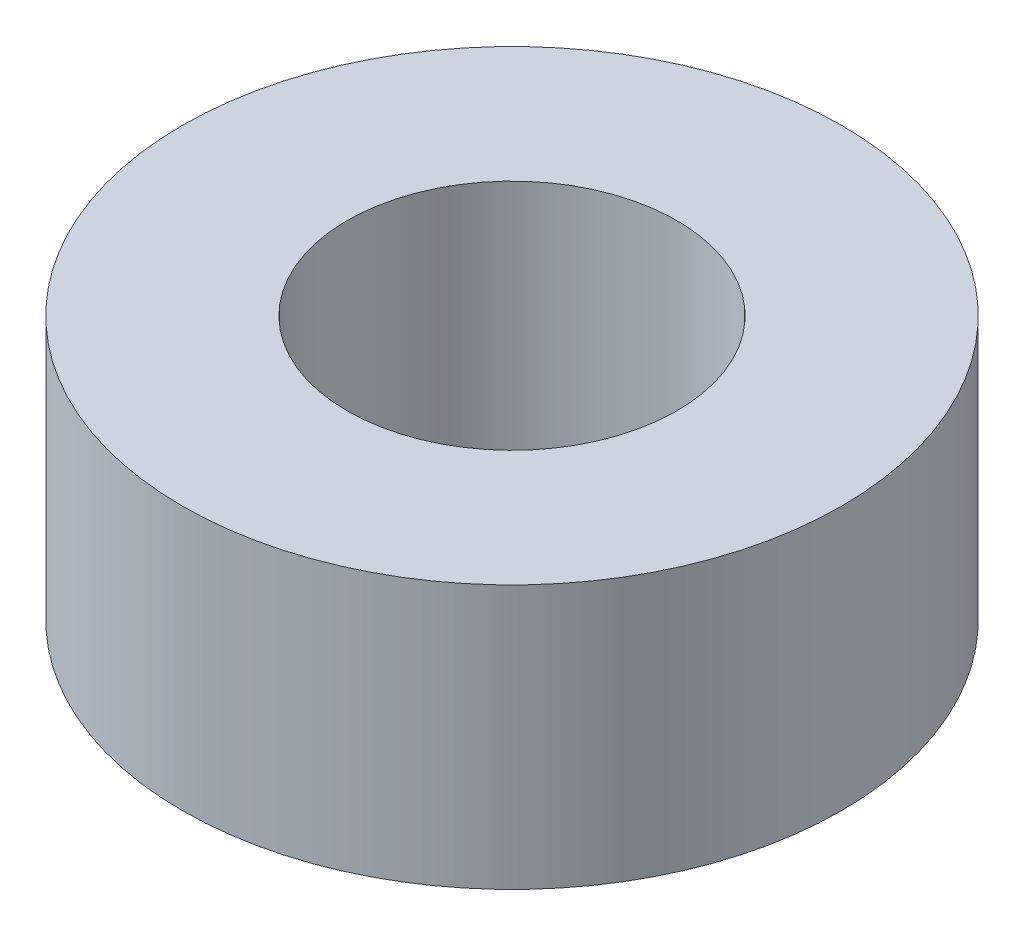
ISO-10303-21;
HEADER;
FILE_DESCRIPTION(('STEP AP214'),'2;1');
FILE_NAME('part.step','',(''),(''),'','','');
FILE_SCHEMA(('AUTOMOTIVE_DESIGN { 1 0 10303 214 1 1 1 1 }'));
ENDSEC;
DATA;
#1=APPLICATION_CONTEXT('core data for automotive mechanical design processes');
#2=APPLICATION_PROTOCOL_DEFINITION('international standard','automotive_design',2000,#1);
#3=PRODUCT_CONTEXT('',#1,'mechanical');
#4=PRODUCT('Part','Part','',(#3));
#5=PRODUCT_RELATED_PRODUCT_CATEGORY('part','',(#4));
#6=PRODUCT_DEFINITION_FORMATION('','',#4);
#7=PRODUCT_DEFINITION_CONTEXT('part definition',#1,'design');
#8=PRODUCT_DEFINITION('design','',#6,#7);
#9=PRODUCT_DEFINITION_SHAPE('','',#8);
#10=(LENGTH_UNIT() NAMED_UNIT(*) SI_UNIT(.MILLI.,.METRE.));
#11=(NAMED_UNIT(*) PLANE_ANGLE_UNIT() SI_UNIT($,.RADIAN.));
#12=(NAMED_UNIT(*) SI_UNIT($,.STERADIAN.) SOLID_ANGLE_UNIT());
#13=UNCERTAINTY_MEASURE_WITH_UNIT(LENGTH_MEASURE(1.E-05),#10,'distance_accuracy_value','');
#14=(GEOMETRIC_REPRESENTATION_CONTEXT(3) GLOBAL_UNCERTAINTY_ASSIGNED_CONTEXT((#13)) GLOBAL_UNIT_ASSIGNED_CONTEXT((#10,
#11,#12)) REPRESENTATION_CONTEXT('',''));
#15=CARTESIAN_POINT('',(0.,0.,0.));
#16=DIRECTION('',(0.,0.,1.));
#17=DIRECTION('',(1.,0.,0.));
#18=AXIS2_PLACEMENT_3D('',#15,#16,#17);
#19=CARTESIAN_POINT('',(0.,4.,0.));
#20=DIRECTION('',(0.,1.,0.));
#21=DIRECTION('',(0.,0.,1.));
#22=AXIS2_PLACEMENT_3D('',#19,#20,#21);
#23=PLANE('',#22);
#24=CARTESIAN_POINT('',(0.,4.,0.));
#25=DIRECTION('',(0.,1.,0.));
#26=DIRECTION('',(0.,0.,1.));
#27=AXIS2_PLACEMENT_3D('',#24,#25,#26);
#28=CIRCLE('',#27,5.);
#29=CARTESIAN_POINT('',(0.,4.,5.));
#30=VERTEX_POINT('',#29);
#31=EDGE_CURVE('E10',#30,#30,#28,.T.);
#32=ORIENTED_EDGE('',*,*,#31,.T.);
#33=EDGE_LOOP('',(#32));
#34=FACE_BOUND('',#33,.T.);
#35=CARTESIAN_POINT('',(0.,4.,0.));
#36=DIRECTION('',(0.,1.,0.));
#37=DIRECTION('',(0.,0.,1.));
#38=AXIS2_PLACEMENT_3D('',#35,#36,#37);
#39=CIRCLE('',#38,2.5);
#40=CARTESIAN_POINT('',(0.,4.,2.5));
#41=VERTEX_POINT('',#40);
#42=EDGE_CURVE('E54',#41,#41,#39,.T.);
#43=ORIENTED_EDGE('',*,*,#42,.F.);
#44=EDGE_LOOP('',(#43));
#45=FACE_BOUND('',#44,.T.);
#46=ADVANCED_FACE('F41',(#34,#45),#23,.T.);
#47=CARTESIAN_POINT('',(0.,0.,0.));
#48=DIRECTION('',(0.,1.,0.));
#49=DIRECTION('',(0.,0.,1.));
#50=AXIS2_PLACEMENT_3D('',#47,#48,#49);
#51=PLANE('',#50);
#52=CARTESIAN_POINT('',(0.,0.,0.));
#53=DIRECTION('',(0.,1.,0.));
#54=DIRECTION('',(0.,0.,1.));
#55=AXIS2_PLACEMENT_3D('',#52,#53,#54);
#56=CIRCLE('',#55,5.);
#57=CARTESIAN_POINT('',(0.,0.,5.));
#58=VERTEX_POINT('',#57);
#59=EDGE_CURVE('E45',#58,#58,#56,.T.);
#60=ORIENTED_EDGE('',*,*,#59,.F.);
#61=EDGE_LOOP('',(#60));
#62=FACE_BOUND('',#61,.T.);
#63=CARTESIAN_POINT('',(0.,0.,0.));
#64=DIRECTION('',(0.,1.,0.));
#65=DIRECTION('',(0.,0.,1.));
#66=AXIS2_PLACEMENT_3D('',#63,#64,#65);
#67=CIRCLE('',#66,2.5);
#68=CARTESIAN_POINT('',(0.,0.,2.5));
#69=VERTEX_POINT('',#68);
#70=EDGE_CURVE('E56',#69,#69,#67,.T.);
#71=ORIENTED_EDGE('',*,*,#70,.T.);
#72=EDGE_LOOP('',(#71));
#73=FACE_BOUND('',#72,.T.);
#74=ADVANCED_FACE('F68',(#62,#73),#51,.F.);
#75=CARTESIAN_POINT('',(0.,4.,0.));
#76=DIRECTION('',(0.,-1.,0.));
#77=DIRECTION('',(0.,0.,-1.));
#78=AXIS2_PLACEMENT_3D('',#75,#76,#77);
#79=CYLINDRICAL_SURFACE('',#78,5.);
#80=ORIENTED_EDGE('',*,*,#31,.F.);
#81=EDGE_LOOP('',(#80));
#82=FACE_BOUND('',#81,.T.);
#83=ORIENTED_EDGE('',*,*,#59,.T.);
#84=EDGE_LOOP('',(#83));
#85=FACE_BOUND('',#84,.T.);
#86=ADVANCED_FACE('F43',(#82,#85),#79,.T.);
#87=CARTESIAN_POINT('',(0.,4.,0.));
#88=DIRECTION('',(0.,-1.,0.));
#89=DIRECTION('',(0.,0.,-1.));
#90=AXIS2_PLACEMENT_3D('',#87,#88,#89);
#91=CYLINDRICAL_SURFACE('',#90,2.5);
#92=ORIENTED_EDGE('',*,*,#42,.T.);
#93=EDGE_LOOP('',(#92));
#94=FACE_BOUND('',#93,.T.);
#95=ORIENTED_EDGE('',*,*,#70,.F.);
#96=EDGE_LOOP('',(#95));
#97=FACE_BOUND('',#96,.T.);
#98=ADVANCED_FACE('F64',(#94,#97),#91,.F.);
#99=CLOSED_SHELL('',(#46,#74,#86,#98));
#100=MANIFOLD_SOLID_BREP('B2',#99);
#101=ADVANCED_BREP_SHAPE_REPRESENTATION('',(#18,#100),#14);
#102=SHAPE_DEFINITION_REPRESENTATION(#9,#101);
ENDSEC;
END-ISO-10303-21;
